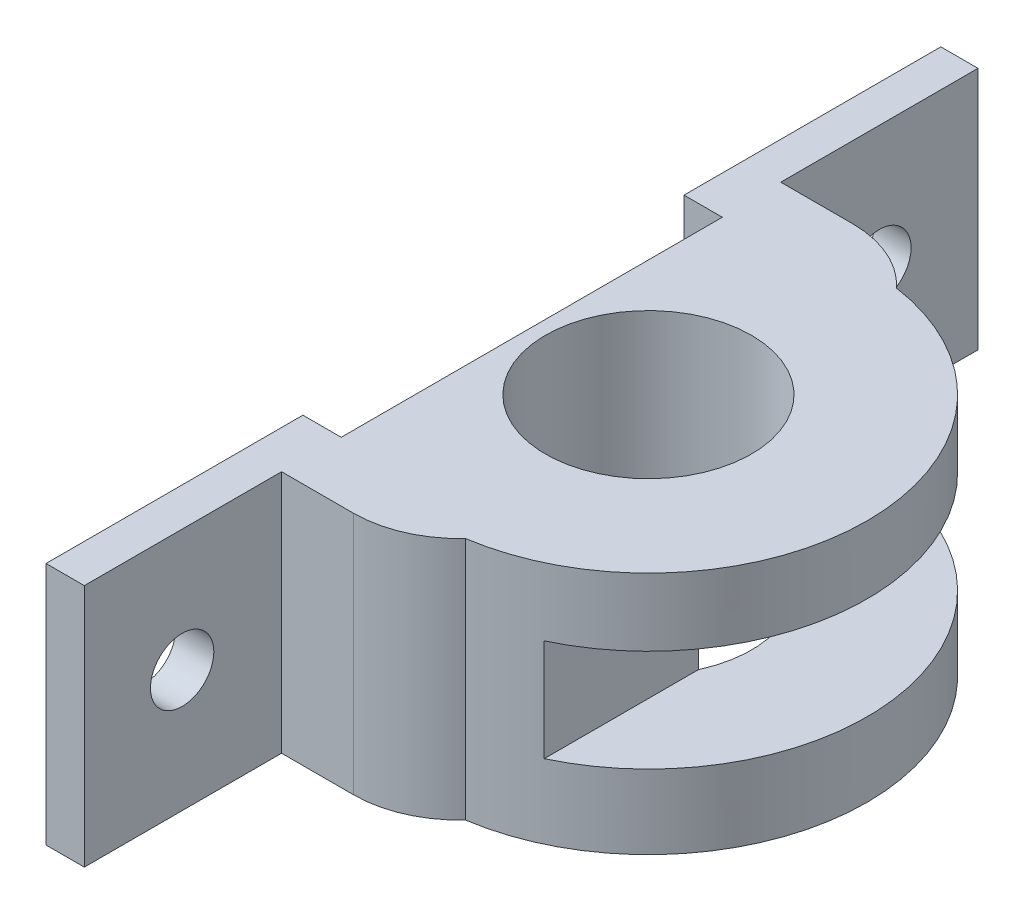
ISO-10303-21;
HEADER;
FILE_DESCRIPTION(('STEP AP214'),'2;1');
FILE_NAME('part.step','',(''),(''),'','','');
FILE_SCHEMA(('AUTOMOTIVE_DESIGN { 1 0 10303 214 1 1 1 1 }'));
ENDSEC;
DATA;
#1=APPLICATION_CONTEXT('core data for automotive mechanical design processes');
#2=APPLICATION_PROTOCOL_DEFINITION('international standard','automotive_design',2000,#1);
#3=PRODUCT_CONTEXT('',#1,'mechanical');
#4=PRODUCT('Part','Part','',(#3));
#5=PRODUCT_RELATED_PRODUCT_CATEGORY('part','',(#4));
#6=PRODUCT_DEFINITION_FORMATION('','',#4);
#7=PRODUCT_DEFINITION_CONTEXT('part definition',#1,'design');
#8=PRODUCT_DEFINITION('design','',#6,#7);
#9=PRODUCT_DEFINITION_SHAPE('','',#8);
#10=(LENGTH_UNIT() NAMED_UNIT(*) SI_UNIT(.MILLI.,.METRE.));
#11=(NAMED_UNIT(*) PLANE_ANGLE_UNIT() SI_UNIT($,.RADIAN.));
#12=(NAMED_UNIT(*) SI_UNIT($,.STERADIAN.) SOLID_ANGLE_UNIT());
#13=UNCERTAINTY_MEASURE_WITH_UNIT(LENGTH_MEASURE(1.E-05),#10,'distance_accuracy_value','');
#14=(GEOMETRIC_REPRESENTATION_CONTEXT(3) GLOBAL_UNCERTAINTY_ASSIGNED_CONTEXT((#13)) GLOBAL_UNIT_ASSIGNED_CONTEXT((#10,
#11,#12)) REPRESENTATION_CONTEXT('',''));
#15=CARTESIAN_POINT('',(0.,0.,0.));
#16=DIRECTION('',(0.,0.,1.));
#17=DIRECTION('',(1.,0.,0.));
#18=AXIS2_PLACEMENT_3D('',#15,#16,#17);
#19=CARTESIAN_POINT('',(0.,-55.2,0.));
#20=DIRECTION('',(0.,1.,0.));
#21=DIRECTION('',(0.,0.,1.));
#22=AXIS2_PLACEMENT_3D('',#19,#20,#21);
#23=CYLINDRICAL_SURFACE('',#22,20.59);
#24=CARTESIAN_POINT('',(0.,4.80402203282774,0.));
#25=DIRECTION('',(0.,1.,0.));
#26=DIRECTION('',(0.,0.,1.));
#27=AXIS2_PLACEMENT_3D('',#24,#25,#26);
#28=CIRCLE('',#27,20.59);
#29=CARTESIAN_POINT('',(8.80000000000003,4.80402203282774,18.6147280399151));
#30=VERTEX_POINT('',#29);
#31=CARTESIAN_POINT('',(8.80000000000003,4.80402203282774,-18.6147280399151));
#32=VERTEX_POINT('',#31);
#33=EDGE_CURVE('E285',#30,#32,#28,.T.);
#34=ORIENTED_EDGE('',*,*,#33,.T.);
#35=DIRECTION('',(0.,1.,0.));
#36=VECTOR('',#35,1.);
#37=CARTESIAN_POINT('',(8.80000000000003,-55.2,-18.614728039915));
#38=LINE('',#37,#36);
#39=CARTESIAN_POINT('',(8.80000000000003,-4.80402203282774,-18.614728039915));
#40=VERTEX_POINT('',#39);
#41=EDGE_CURVE('E286',#40,#32,#38,.T.);
#42=ORIENTED_EDGE('',*,*,#41,.F.);
#43=CARTESIAN_POINT('',(0.,-4.80402203282775,0.));
#44=DIRECTION('',(0.,-1.,0.));
#45=DIRECTION('',(0.,0.,-1.));
#46=AXIS2_PLACEMENT_3D('',#43,#44,#45);
#47=CIRCLE('',#46,20.59);
#48=CARTESIAN_POINT('',(8.80000000000003,-4.80402203282774,18.614728039915));
#49=VERTEX_POINT('',#48);
#50=EDGE_CURVE('E282',#40,#49,#47,.T.);
#51=ORIENTED_EDGE('',*,*,#50,.T.);
#52=DIRECTION('',(0.,1.,0.));
#53=VECTOR('',#52,1.);
#54=CARTESIAN_POINT('',(8.80000000000003,-55.2,18.614728039915));
#55=LINE('',#54,#53);
#56=EDGE_CURVE('E289',#30,#49,#55,.F.);
#57=ORIENTED_EDGE('',*,*,#56,.F.);
#58=EDGE_LOOP('',(#34,#42,#51,#57));
#59=FACE_BOUND('',#58,.T.);
#60=DIRECTION('',(0.,1.,0.));
#61=VECTOR('',#60,1.);
#62=CARTESIAN_POINT('',(3.10851186960473,-55.2,20.3539984758898));
#63=LINE('',#62,#61);
#64=CARTESIAN_POINT('',(3.10851186960473,-11.785,20.3539984758898));
#65=VERTEX_POINT('',#64);
#66=CARTESIAN_POINT('',(3.10851186960473,11.1805911601393,20.3539984758898));
#67=VERTEX_POINT('',#66);
#68=EDGE_CURVE('E274',#65,#67,#63,.T.);
#69=ORIENTED_EDGE('',*,*,#68,.F.);
#70=CARTESIAN_POINT('',(0.,-11.785,0.));
#71=DIRECTION('',(0.,1.,0.));
#72=DIRECTION('',(0.,0.,1.));
#73=AXIS2_PLACEMENT_3D('',#70,#71,#72);
#74=CIRCLE('',#73,20.59);
#75=CARTESIAN_POINT('',(3.00000000000002,-11.785,-20.3702749122342));
#76=VERTEX_POINT('',#75);
#77=EDGE_CURVE('E280',#65,#76,#74,.T.);
#78=ORIENTED_EDGE('',*,*,#77,.T.);
#79=DIRECTION('',(0.,1.,0.));
#80=VECTOR('',#79,1.);
#81=CARTESIAN_POINT('',(3.00000000000003,-55.2,-20.3702749122342));
#82=LINE('',#81,#80);
#83=CARTESIAN_POINT('',(3.00000000000002,11.1805911601393,-20.3702749122343));
#84=VERTEX_POINT('',#83);
#85=EDGE_CURVE('E278',#76,#84,#82,.T.);
#86=ORIENTED_EDGE('',*,*,#85,.T.);
#87=CARTESIAN_POINT('',(0.,11.1805911601393,0.));
#88=DIRECTION('',(0.,-1.,0.));
#89=DIRECTION('',(0.,0.,-1.));
#90=AXIS2_PLACEMENT_3D('',#87,#88,#89);
#91=CIRCLE('',#90,20.59);
#92=EDGE_CURVE('E275',#84,#67,#91,.T.);
#93=ORIENTED_EDGE('',*,*,#92,.T.);
#94=EDGE_LOOP('',(#69,#78,#86,#93));
#95=FACE_BOUND('',#94,.T.);
#96=ADVANCED_FACE('F55',(#59,#95),#23,.T.);
#97=CARTESIAN_POINT('',(-16.2413436660295,11.1805911601393,-36.1));
#98=DIRECTION('',(0.,-1.,0.));
#99=DIRECTION('',(0.,0.,-1.));
#100=AXIS2_PLACEMENT_3D('',#97,#98,#99);
#101=PLANE('',#100);
#102=DIRECTION('',(-1.,0.,0.));
#103=VECTOR('',#102,1.);
#104=CARTESIAN_POINT('',(-10.9914881303953,11.1805911601393,-17.950780817625));
#105=LINE('',#104,#103);
#106=CARTESIAN_POINT('',(-10.9914881303953,11.1805911601393,-17.950780817625));
#107=VERTEX_POINT('',#106);
#108=CARTESIAN_POINT('',(-14.6,11.1805911601393,-17.950780817625));
#109=VERTEX_POINT('',#108);
#110=EDGE_CURVE('E206',#107,#109,#105,.T.);
#111=ORIENTED_EDGE('',*,*,#110,.F.);
#112=DIRECTION('',(0.,0.,1.));
#113=VECTOR('',#112,1.);
#114=CARTESIAN_POINT('',(-10.9914881303953,11.1805911601393,-36.1));
#115=LINE('',#114,#113);
#116=CARTESIAN_POINT('',(-10.9914881303953,11.1805911601393,17.9454043331375));
#117=VERTEX_POINT('',#116);
#118=EDGE_CURVE('E199',#107,#117,#115,.T.);
#119=ORIENTED_EDGE('',*,*,#118,.T.);
#120=DIRECTION('',(1.,0.,0.));
#121=VECTOR('',#120,1.);
#122=CARTESIAN_POINT('',(-10.9914881303953,11.1805911601393,17.9454043331375));
#123=LINE('',#122,#121);
#124=CARTESIAN_POINT('',(-14.6,11.1805911601393,17.9454043331375));
#125=VERTEX_POINT('',#124);
#126=EDGE_CURVE('E210',#125,#117,#123,.T.);
#127=ORIENTED_EDGE('',*,*,#126,.F.);
#128=DIRECTION('',(0.,0.,-1.));
#129=VECTOR('',#128,1.);
#130=CARTESIAN_POINT('',(-14.6,11.1805911601393,44.689219182375));
#131=LINE('',#130,#129);
#132=CARTESIAN_POINT('',(-14.6,11.1805911601393,42.140780817625));
#133=VERTEX_POINT('',#132);
#134=EDGE_CURVE('E248',#133,#125,#131,.T.);
#135=ORIENTED_EDGE('',*,*,#134,.F.);
#136=DIRECTION('',(1.,0.,0.));
#137=VECTOR('',#136,1.);
#138=CARTESIAN_POINT('',(-16.2413436660295,11.1805911601393,42.140780817625));
#139=LINE('',#138,#137);
#140=CARTESIAN_POINT('',(-10.9914881303953,11.1805911601393,42.140780817625));
#141=VERTEX_POINT('',#140);
#142=EDGE_CURVE('E64',#133,#141,#139,.T.);
#143=ORIENTED_EDGE('',*,*,#142,.T.);
#144=DIRECTION('',(0.,0.,-1.));
#145=VECTOR('',#144,1.);
#146=CARTESIAN_POINT('',(-10.9914881303953,11.1805911601393,45.660780817625));
#147=LINE('',#146,#145);
#148=CARTESIAN_POINT('',(-10.9914881303953,11.1805911601393,23.560780817625));
#149=VERTEX_POINT('',#148);
#150=EDGE_CURVE('E242',#141,#149,#147,.T.);
#151=ORIENTED_EDGE('',*,*,#150,.T.);
#152=DIRECTION('',(-1.,0.,0.));
#153=VECTOR('',#152,1.);
#154=CARTESIAN_POINT('',(3.10851186960473,11.1805911601393,23.560780817625));
#155=LINE('',#154,#153);
#156=CARTESIAN_POINT('',(-4.2298935326226,11.1805911601393,23.560780817625));
#157=VERTEX_POINT('',#156);
#158=EDGE_CURVE('E256',#157,#149,#155,.T.);
#159=ORIENTED_EDGE('',*,*,#158,.F.);
#160=CARTESIAN_POINT('',(-4.2298935326226,11.1805911601393,13.560780817625));
#161=DIRECTION('',(0.,-1.,0.));
#162=DIRECTION('',(0.,0.,-1.));
#163=AXIS2_PLACEMENT_3D('',#160,#161,#162);
#164=CIRCLE('',#163,10.);
#165=EDGE_CURVE('E329',#157,#67,#164,.F.);
#166=ORIENTED_EDGE('',*,*,#165,.T.);
#167=ORIENTED_EDGE('',*,*,#92,.F.);
#168=CARTESIAN_POINT('',(-4.32210177975512,11.1805911601393,-13.5594874741397));
#169=DIRECTION('',(0.,-1.,0.));
#170=DIRECTION('',(0.,0.,-1.));
#171=AXIS2_PLACEMENT_3D('',#168,#169,#170);
#172=CIRCLE('',#171,10.);
#173=CARTESIAN_POINT('',(-4.32210177975512,11.1805911601393,-23.5594874741397));
#174=VERTEX_POINT('',#173);
#175=EDGE_CURVE('E268',#84,#174,#172,.F.);
#176=ORIENTED_EDGE('',*,*,#175,.T.);
#177=DIRECTION('',(1.,0.,0.));
#178=VECTOR('',#177,1.);
#179=CARTESIAN_POINT('',(-16.1,11.1805911601393,-23.5594874741397));
#180=LINE('',#179,#178);
#181=CARTESIAN_POINT('',(-11.1,11.1805911601393,-23.5594874741397));
#182=VERTEX_POINT('',#181);
#183=EDGE_CURVE('E267',#182,#174,#180,.T.);
#184=ORIENTED_EDGE('',*,*,#183,.F.);
#185=DIRECTION('',(0.,0.,-1.));
#186=VECTOR('',#185,1.);
#187=CARTESIAN_POINT('',(-11.1,11.1805911601393,-42.1394874741397));
#188=LINE('',#187,#186);
#189=CARTESIAN_POINT('',(-11.1,11.1805911601393,-42.1394874741397));
#190=VERTEX_POINT('',#189);
#191=EDGE_CURVE('E71',#182,#190,#188,.T.);
#192=ORIENTED_EDGE('',*,*,#191,.T.);
#193=DIRECTION('',(-1.,0.,0.));
#194=VECTOR('',#193,1.);
#195=CARTESIAN_POINT('',(-14.6,11.1805911601393,-42.1394874741397));
#196=LINE('',#195,#194);
#197=CARTESIAN_POINT('',(-14.6,11.1805911601393,-42.1394874741397));
#198=VERTEX_POINT('',#197);
#199=EDGE_CURVE('E12',#190,#198,#196,.T.);
#200=ORIENTED_EDGE('',*,*,#199,.T.);
#201=DIRECTION('',(0.,0.,1.));
#202=VECTOR('',#201,1.);
#203=CARTESIAN_POINT('',(-14.6,11.1805911601393,-17.410780817625));
#204=LINE('',#203,#202);
#205=EDGE_CURVE('E227',#198,#109,#204,.T.);
#206=ORIENTED_EDGE('',*,*,#205,.T.);
#207=EDGE_LOOP('',(#111,#119,#127,#135,#143,#151,#159,#166,#167,#176,#184,#192,#200,#206));
#208=FACE_BOUND('',#207,.T.);
#209=CARTESIAN_POINT('',(0.,11.1805911601393,0.));
#210=DIRECTION('',(0.,-1.,0.));
#211=DIRECTION('',(0.,0.,-1.));
#212=AXIS2_PLACEMENT_3D('',#209,#210,#211);
#213=CIRCLE('',#212,9.7);
#214=CARTESIAN_POINT('',(0.,11.1805911601393,-9.7));
#215=VERTEX_POINT('',#214);
#216=EDGE_CURVE('E270',#215,#215,#213,.T.);
#217=ORIENTED_EDGE('',*,*,#216,.T.);
#218=EDGE_LOOP('',(#217));
#219=FACE_BOUND('',#218,.T.);
#220=ADVANCED_FACE('F354',(#208,#219),#101,.F.);
#221=CARTESIAN_POINT('',(-1.39148813039528,-11.785,-34.2));
#222=DIRECTION('',(0.,1.,0.));
#223=DIRECTION('',(0.,0.,1.));
#224=AXIS2_PLACEMENT_3D('',#221,#222,#223);
#225=PLANE('',#224);
#226=DIRECTION('',(0.,0.,-1.));
#227=VECTOR('',#226,1.);
#228=CARTESIAN_POINT('',(-10.9914881303953,-11.785,-34.2));
#229=LINE('',#228,#227);
#230=CARTESIAN_POINT('',(-10.9914881303953,-11.785,17.9454043331375));
#231=VERTEX_POINT('',#230);
#232=CARTESIAN_POINT('',(-10.9914881303953,-11.785,-17.950780817625));
#233=VERTEX_POINT('',#232);
#234=EDGE_CURVE('E181',#231,#233,#229,.T.);
#235=ORIENTED_EDGE('',*,*,#234,.T.);
#236=DIRECTION('',(-1.,0.,0.));
#237=VECTOR('',#236,1.);
#238=CARTESIAN_POINT('',(-10.9914881303953,-11.785,-17.950780817625));
#239=LINE('',#238,#237);
#240=CARTESIAN_POINT('',(-14.6,-11.785,-17.950780817625));
#241=VERTEX_POINT('',#240);
#242=EDGE_CURVE('E186',#233,#241,#239,.T.);
#243=ORIENTED_EDGE('',*,*,#242,.T.);
#244=DIRECTION('',(0.,0.,-1.));
#245=VECTOR('',#244,1.);
#246=CARTESIAN_POINT('',(-14.6,-11.785,-17.410780817625));
#247=LINE('',#246,#245);
#248=CARTESIAN_POINT('',(-14.6,-11.785,-42.1394874741397));
#249=VERTEX_POINT('',#248);
#250=EDGE_CURVE('E311',#241,#249,#247,.T.);
#251=ORIENTED_EDGE('',*,*,#250,.T.);
#252=DIRECTION('',(1.,0.,0.));
#253=VECTOR('',#252,1.);
#254=CARTESIAN_POINT('',(-14.6,-11.785,-42.1394874741397));
#255=LINE('',#254,#253);
#256=CARTESIAN_POINT('',(-11.1,-11.785,-42.1394874741397));
#257=VERTEX_POINT('',#256);
#258=EDGE_CURVE('E230',#249,#257,#255,.T.);
#259=ORIENTED_EDGE('',*,*,#258,.T.);
#260=DIRECTION('',(0.,0.,1.));
#261=VECTOR('',#260,1.);
#262=CARTESIAN_POINT('',(-11.1,-11.785,-36.510780817625));
#263=LINE('',#262,#261);
#264=CARTESIAN_POINT('',(-11.1,-11.785,-23.5594874741397));
#265=VERTEX_POINT('',#264);
#266=EDGE_CURVE('E263',#257,#265,#263,.T.);
#267=ORIENTED_EDGE('',*,*,#266,.T.);
#268=DIRECTION('',(-1.,0.,0.));
#269=VECTOR('',#268,1.);
#270=CARTESIAN_POINT('',(3.00000000000002,-11.785,-23.5594874741397));
#271=LINE('',#270,#269);
#272=CARTESIAN_POINT('',(-4.32210177975512,-11.785,-23.5594874741397));
#273=VERTEX_POINT('',#272);
#274=EDGE_CURVE('E266',#273,#265,#271,.T.);
#275=ORIENTED_EDGE('',*,*,#274,.F.);
#276=CARTESIAN_POINT('',(-4.32210177975512,-11.785,-13.5594874741397));
#277=DIRECTION('',(0.,1.,0.));
#278=DIRECTION('',(0.,0.,1.));
#279=AXIS2_PLACEMENT_3D('',#276,#277,#278);
#280=CIRCLE('',#279,10.);
#281=EDGE_CURVE('E194',#273,#76,#280,.F.);
#282=ORIENTED_EDGE('',*,*,#281,.T.);
#283=ORIENTED_EDGE('',*,*,#77,.F.);
#284=CARTESIAN_POINT('',(-4.2298935326226,-11.785,13.560780817625));
#285=DIRECTION('',(0.,1.,0.));
#286=DIRECTION('',(0.,0.,1.));
#287=AXIS2_PLACEMENT_3D('',#284,#285,#286);
#288=CIRCLE('',#287,10.);
#289=CARTESIAN_POINT('',(-4.22989353262259,-11.785,23.560780817625));
#290=VERTEX_POINT('',#289);
#291=EDGE_CURVE('E325',#65,#290,#288,.F.);
#292=ORIENTED_EDGE('',*,*,#291,.T.);
#293=DIRECTION('',(-1.,0.,0.));
#294=VECTOR('',#293,1.);
#295=CARTESIAN_POINT('',(3.10851186960473,-11.785,23.560780817625));
#296=LINE('',#295,#294);
#297=CARTESIAN_POINT('',(-10.9914881303953,-11.785,23.560780817625));
#298=VERTEX_POINT('',#297);
#299=EDGE_CURVE('E259',#290,#298,#296,.T.);
#300=ORIENTED_EDGE('',*,*,#299,.T.);
#301=DIRECTION('',(0.,0.,1.));
#302=VECTOR('',#301,1.);
#303=CARTESIAN_POINT('',(-10.9914881303953,-11.785,23.560780817625));
#304=LINE('',#303,#302);
#305=CARTESIAN_POINT('',(-10.9914881303953,-11.785,42.140780817625));
#306=VERTEX_POINT('',#305);
#307=EDGE_CURVE('E245',#298,#306,#304,.T.);
#308=ORIENTED_EDGE('',*,*,#307,.T.);
#309=DIRECTION('',(1.,0.,0.));
#310=VECTOR('',#309,1.);
#311=CARTESIAN_POINT('',(-10.9914881303953,-11.785,42.140780817625));
#312=LINE('',#311,#310);
#313=CARTESIAN_POINT('',(-14.6,-11.785,42.140780817625));
#314=VERTEX_POINT('',#313);
#315=EDGE_CURVE('E236',#314,#306,#312,.T.);
#316=ORIENTED_EDGE('',*,*,#315,.F.);
#317=DIRECTION('',(0.,0.,-1.));
#318=VECTOR('',#317,1.);
#319=CARTESIAN_POINT('',(-14.6,-11.785,-17.410780817625));
#320=LINE('',#319,#318);
#321=CARTESIAN_POINT('',(-14.6,-11.785,17.9454043331375));
#322=VERTEX_POINT('',#321);
#323=EDGE_CURVE('E251',#314,#322,#320,.T.);
#324=ORIENTED_EDGE('',*,*,#323,.T.);
#325=DIRECTION('',(1.,0.,0.));
#326=VECTOR('',#325,1.);
#327=CARTESIAN_POINT('',(-10.9914881303953,-11.785,17.9454043331375));
#328=LINE('',#327,#326);
#329=EDGE_CURVE('E189',#322,#231,#328,.T.);
#330=ORIENTED_EDGE('',*,*,#329,.T.);
#331=EDGE_LOOP('',(#235,#243,#251,#259,#267,#275,#282,#283,#292,#300,#308,#316,#324,#330));
#332=FACE_BOUND('',#331,.T.);
#333=CARTESIAN_POINT('',(0.,-11.785,0.));
#334=DIRECTION('',(0.,-1.,0.));
#335=DIRECTION('',(0.,0.,-1.));
#336=AXIS2_PLACEMENT_3D('',#333,#334,#335);
#337=CIRCLE('',#336,9.7);
#338=CARTESIAN_POINT('',(0.,-11.785,-9.7));
#339=VERTEX_POINT('',#338);
#340=EDGE_CURVE('E306',#339,#339,#337,.T.);
#341=ORIENTED_EDGE('',*,*,#340,.F.);
#342=EDGE_LOOP('',(#341));
#343=FACE_BOUND('',#342,.T.);
#344=ADVANCED_FACE('F183',(#332,#343),#225,.F.);
#345=CARTESIAN_POINT('',(-10.9914881303953,-55.2,-20.68));
#346=DIRECTION('',(1.,0.,0.));
#347=DIRECTION('',(0.,0.,-1.));
#348=AXIS2_PLACEMENT_3D('',#345,#346,#347);
#349=PLANE('',#348);
#350=ORIENTED_EDGE('',*,*,#118,.F.);
#351=DIRECTION('',(0.,1.,0.));
#352=VECTOR('',#351,1.);
#353=CARTESIAN_POINT('',(-10.9914881303953,-11.785,-17.950780817625));
#354=LINE('',#353,#352);
#355=EDGE_CURVE('E197',#233,#107,#354,.T.);
#356=ORIENTED_EDGE('',*,*,#355,.F.);
#357=ORIENTED_EDGE('',*,*,#234,.F.);
#358=DIRECTION('',(0.,1.,0.));
#359=VECTOR('',#358,1.);
#360=CARTESIAN_POINT('',(-10.9914881303953,-11.785,17.9454043331375));
#361=LINE('',#360,#359);
#362=EDGE_CURVE('E216',#231,#117,#361,.T.);
#363=ORIENTED_EDGE('',*,*,#362,.T.);
#364=EDGE_LOOP('',(#350,#356,#357,#363));
#365=FACE_BOUND('',#364,.T.);
#366=ADVANCED_FACE('F198',(#365),#349,.F.);
#367=CARTESIAN_POINT('',(-14.6,11.315,-17.410780817625));
#368=DIRECTION('',(-1.,0.,0.));
#369=DIRECTION('',(0.,0.,1.));
#370=AXIS2_PLACEMENT_3D('',#367,#368,#369);
#371=PLANE('',#370);
#372=DIRECTION('',(0.,1.,0.));
#373=VECTOR('',#372,1.);
#374=CARTESIAN_POINT('',(-14.6,-11.785,-17.950780817625));
#375=LINE('',#374,#373);
#376=EDGE_CURVE('E202',#241,#109,#375,.T.);
#377=ORIENTED_EDGE('',*,*,#376,.T.);
#378=ORIENTED_EDGE('',*,*,#205,.F.);
#379=DIRECTION('',(0.,-1.,0.));
#380=VECTOR('',#379,1.);
#381=CARTESIAN_POINT('',(-14.6,11.315,-42.1394874741397));
#382=LINE('',#381,#380);
#383=EDGE_CURVE('E233',#198,#249,#382,.T.);
#384=ORIENTED_EDGE('',*,*,#383,.T.);
#385=ORIENTED_EDGE('',*,*,#250,.F.);
#386=EDGE_LOOP('',(#377,#378,#384,#385));
#387=FACE_BOUND('',#386,.T.);
#388=CARTESIAN_POINT('',(-14.6,-0.302204419938334,-32.8494874741397));
#389=DIRECTION('',(-1.,0.,0.));
#390=DIRECTION('',(0.,0.,1.));
#391=AXIS2_PLACEMENT_3D('',#388,#389,#390);
#392=CIRCLE('',#391,2.98499999999359);
#393=CARTESIAN_POINT('',(-14.6,-0.302204419938334,-29.8644874741461));
#394=VERTEX_POINT('',#393);
#395=EDGE_CURVE('E219',#394,#394,#392,.T.);
#396=ORIENTED_EDGE('',*,*,#395,.F.);
#397=EDGE_LOOP('',(#396));
#398=FACE_BOUND('',#397,.T.);
#399=ADVANCED_FACE('F366',(#387,#398),#371,.T.);
#400=CARTESIAN_POINT('',(8.80000000000003,4.80402203282774,22.440347469412));
#401=DIRECTION('',(0.,1.,0.));
#402=DIRECTION('',(0.,0.,1.));
#403=AXIS2_PLACEMENT_3D('',#400,#401,#402);
#404=PLANE('',#403);
#405=ORIENTED_EDGE('',*,*,#33,.F.);
#406=DIRECTION('',(0.,0.,1.));
#407=VECTOR('',#406,1.);
#408=CARTESIAN_POINT('',(8.80000000000003,4.80402203282774,22.440347469412));
#409=LINE('',#408,#407);
#410=CARTESIAN_POINT('',(8.80000000000003,4.80402203282774,4.08044115262057));
#411=VERTEX_POINT('',#410);
#412=EDGE_CURVE('E292',#411,#30,#409,.T.);
#413=ORIENTED_EDGE('',*,*,#412,.F.);
#414=CARTESIAN_POINT('',(0.,4.80402203282774,0.));
#415=DIRECTION('',(0.,1.,0.));
#416=DIRECTION('',(0.,0.,1.));
#417=AXIS2_PLACEMENT_3D('',#414,#415,#416);
#418=CIRCLE('',#417,9.7);
#419=CARTESIAN_POINT('',(8.80000000000003,4.80402203282774,-4.08044115262056));
#420=VERTEX_POINT('',#419);
#421=EDGE_CURVE('E193',#411,#420,#418,.T.);
#422=ORIENTED_EDGE('',*,*,#421,.T.);
#423=EDGE_CURVE('E288',#32,#420,#409,.T.);
#424=ORIENTED_EDGE('',*,*,#423,.F.);
#425=EDGE_LOOP('',(#405,#413,#422,#424));
#426=FACE_BOUND('',#425,.T.);
#427=ADVANCED_FACE('F367',(#426),#404,.F.);
#428=CARTESIAN_POINT('',(8.80000000000003,0.,0.));
#429=DIRECTION('',(1.,0.,0.));
#430=DIRECTION('',(0.,0.,-1.));
#431=AXIS2_PLACEMENT_3D('',#428,#429,#430);
#432=PLANE('',#431);
#433=ORIENTED_EDGE('',*,*,#41,.T.);
#434=ORIENTED_EDGE('',*,*,#423,.T.);
#435=DIRECTION('',(0.,-1.,0.));
#436=VECTOR('',#435,1.);
#437=CARTESIAN_POINT('',(8.80000000000003,11.1805911601393,-4.08044115262056));
#438=LINE('',#437,#436);
#439=CARTESIAN_POINT('',(8.80000000000003,-4.80402203282775,-4.08044115262056));
#440=VERTEX_POINT('',#439);
#441=EDGE_CURVE('E297',#440,#420,#438,.F.);
#442=ORIENTED_EDGE('',*,*,#441,.F.);
#443=DIRECTION('',(0.,0.,-1.));
#444=VECTOR('',#443,1.);
#445=CARTESIAN_POINT('',(8.80000000000003,-4.80402203282774,22.440347469412));
#446=LINE('',#445,#444);
#447=EDGE_CURVE('E293',#440,#40,#446,.T.);
#448=ORIENTED_EDGE('',*,*,#447,.T.);
#449=EDGE_LOOP('',(#433,#434,#442,#448));
#450=FACE_BOUND('',#449,.T.);
#451=ADVANCED_FACE('F370',(#450),#432,.T.);
#452=ORIENTED_EDGE('',*,*,#412,.T.);
#453=ORIENTED_EDGE('',*,*,#56,.T.);
#454=CARTESIAN_POINT('',(8.80000000000003,-4.80402203282774,4.08044115262056));
#455=VERTEX_POINT('',#454);
#456=EDGE_CURVE('E291',#49,#455,#446,.T.);
#457=ORIENTED_EDGE('',*,*,#456,.T.);
#458=DIRECTION('',(0.,-1.,0.));
#459=VECTOR('',#458,1.);
#460=CARTESIAN_POINT('',(8.80000000000003,11.1805911601393,4.08044115262056));
#461=LINE('',#460,#459);
#462=EDGE_CURVE('E300',#411,#455,#461,.T.);
#463=ORIENTED_EDGE('',*,*,#462,.F.);
#464=EDGE_LOOP('',(#452,#453,#457,#463));
#465=FACE_BOUND('',#464,.T.);
#466=ADVANCED_FACE('F376',(#465),#432,.T.);
#467=CARTESIAN_POINT('',(8.80000000000003,-4.80402203282774,22.440347469412));
#468=DIRECTION('',(0.,-1.,0.));
#469=DIRECTION('',(0.,0.,-1.));
#470=AXIS2_PLACEMENT_3D('',#467,#468,#469);
#471=PLANE('',#470);
#472=ORIENTED_EDGE('',*,*,#447,.F.);
#473=CARTESIAN_POINT('',(0.,-4.80402203282775,0.));
#474=DIRECTION('',(0.,-1.,0.));
#475=DIRECTION('',(0.,0.,-1.));
#476=AXIS2_PLACEMENT_3D('',#473,#474,#475);
#477=CIRCLE('',#476,9.7);
#478=EDGE_CURVE('E277',#440,#455,#477,.T.);
#479=ORIENTED_EDGE('',*,*,#478,.T.);
#480=ORIENTED_EDGE('',*,*,#456,.F.);
#481=ORIENTED_EDGE('',*,*,#50,.F.);
#482=EDGE_LOOP('',(#472,#479,#480,#481));
#483=FACE_BOUND('',#482,.T.);
#484=ADVANCED_FACE('F372',(#483),#471,.F.);
#485=CARTESIAN_POINT('',(0.,11.1805911601393,0.));
#486=DIRECTION('',(0.,-1.,0.));
#487=DIRECTION('',(0.,0.,-1.));
#488=AXIS2_PLACEMENT_3D('',#485,#486,#487);
#489=CYLINDRICAL_SURFACE('',#488,9.7);
#490=ORIENTED_EDGE('',*,*,#441,.T.);
#491=ORIENTED_EDGE('',*,*,#421,.F.);
#492=ORIENTED_EDGE('',*,*,#462,.T.);
#493=ORIENTED_EDGE('',*,*,#478,.F.);
#494=EDGE_LOOP('',(#490,#491,#492,#493));
#495=FACE_BOUND('',#494,.T.);
#496=ORIENTED_EDGE('',*,*,#216,.F.);
#497=EDGE_LOOP('',(#496));
#498=FACE_BOUND('',#497,.T.);
#499=ORIENTED_EDGE('',*,*,#340,.T.);
#500=EDGE_LOOP('',(#499));
#501=FACE_BOUND('',#500,.T.);
#502=ADVANCED_FACE('F375',(#495,#498,#501),#489,.F.);
#503=CARTESIAN_POINT('',(3.00000000000002,-11.785,-23.5594874741397));
#504=DIRECTION('',(0.,0.,1.));
#505=DIRECTION('',(1.,0.,0.));
#506=AXIS2_PLACEMENT_3D('',#503,#504,#505);
#507=PLANE('',#506);
#508=ORIENTED_EDGE('',*,*,#183,.T.);
#509=DIRECTION('',(0.,1.,0.));
#510=VECTOR('',#509,1.);
#511=CARTESIAN_POINT('',(-4.32210177975512,-11.785,-23.5594874741397));
#512=LINE('',#511,#510);
#513=EDGE_CURVE('E264',#174,#273,#512,.F.);
#514=ORIENTED_EDGE('',*,*,#513,.T.);
#515=ORIENTED_EDGE('',*,*,#274,.T.);
#516=DIRECTION('',(0.,1.,0.));
#517=VECTOR('',#516,1.);
#518=CARTESIAN_POINT('',(-11.1,-11.785,-23.5594874741397));
#519=LINE('',#518,#517);
#520=EDGE_CURVE('E271',#265,#182,#519,.T.);
#521=ORIENTED_EDGE('',*,*,#520,.T.);
#522=EDGE_LOOP('',(#508,#514,#515,#521));
#523=FACE_BOUND('',#522,.T.);
#524=ADVANCED_FACE('F383',(#523),#507,.F.);
#525=CARTESIAN_POINT('',(-11.1,11.1805911601393,-36.510780817625));
#526=DIRECTION('',(1.,0.,0.));
#527=DIRECTION('',(0.,0.,-1.));
#528=AXIS2_PLACEMENT_3D('',#525,#526,#527);
#529=PLANE('',#528);
#530=CARTESIAN_POINT('',(-11.1,-0.302204419938334,-32.8494874741397));
#531=DIRECTION('',(1.,0.,0.));
#532=DIRECTION('',(0.,0.,-1.));
#533=AXIS2_PLACEMENT_3D('',#530,#531,#532);
#534=CIRCLE('',#533,2.98499999999359);
#535=CARTESIAN_POINT('',(-11.1,-0.302204419938334,-35.8344874741333));
#536=VERTEX_POINT('',#535);
#537=EDGE_CURVE('E59',#536,#536,#534,.T.);
#538=ORIENTED_EDGE('',*,*,#537,.F.);
#539=EDGE_LOOP('',(#538));
#540=FACE_BOUND('',#539,.T.);
#541=ORIENTED_EDGE('',*,*,#191,.F.);
#542=ORIENTED_EDGE('',*,*,#520,.F.);
#543=ORIENTED_EDGE('',*,*,#266,.F.);
#544=DIRECTION('',(0.,-1.,0.));
#545=VECTOR('',#544,1.);
#546=CARTESIAN_POINT('',(-11.1,11.315,-42.1394874741397));
#547=LINE('',#546,#545);
#548=EDGE_CURVE('E234',#190,#257,#547,.T.);
#549=ORIENTED_EDGE('',*,*,#548,.F.);
#550=EDGE_LOOP('',(#541,#542,#543,#549));
#551=FACE_BOUND('',#550,.T.);
#552=ADVANCED_FACE('F387',(#540,#551),#529,.T.);
#553=CARTESIAN_POINT('',(-4.32210177975512,-55.2,-13.5594874741397));
#554=DIRECTION('',(0.,1.,0.));
#555=DIRECTION('',(0.,0.,1.));
#556=AXIS2_PLACEMENT_3D('',#553,#554,#555);
#557=CYLINDRICAL_SURFACE('',#556,10.);
#558=ORIENTED_EDGE('',*,*,#281,.F.);
#559=ORIENTED_EDGE('',*,*,#513,.F.);
#560=ORIENTED_EDGE('',*,*,#175,.F.);
#561=ORIENTED_EDGE('',*,*,#85,.F.);
#562=EDGE_LOOP('',(#558,#559,#560,#561));
#563=FACE_BOUND('',#562,.T.);
#564=ADVANCED_FACE('F363',(#563),#557,.T.);
#565=CARTESIAN_POINT('',(3.10851186960473,-11.785,23.560780817625));
#566=DIRECTION('',(0.,0.,-1.));
#567=DIRECTION('',(-1.,0.,0.));
#568=AXIS2_PLACEMENT_3D('',#565,#566,#567);
#569=PLANE('',#568);
#570=ORIENTED_EDGE('',*,*,#299,.F.);
#571=DIRECTION('',(0.,1.,0.));
#572=VECTOR('',#571,1.);
#573=CARTESIAN_POINT('',(-4.2298935326226,-11.785,23.560780817625));
#574=LINE('',#573,#572);
#575=EDGE_CURVE('E327',#290,#157,#574,.T.);
#576=ORIENTED_EDGE('',*,*,#575,.T.);
#577=ORIENTED_EDGE('',*,*,#158,.T.);
#578=DIRECTION('',(0.,-1.,0.));
#579=VECTOR('',#578,1.);
#580=CARTESIAN_POINT('',(-10.9914881303953,-11.785,23.560780817625));
#581=LINE('',#580,#579);
#582=EDGE_CURVE('E253',#149,#298,#581,.T.);
#583=ORIENTED_EDGE('',*,*,#582,.T.);
#584=EDGE_LOOP('',(#570,#576,#577,#583));
#585=FACE_BOUND('',#584,.T.);
#586=ADVANCED_FACE('F348',(#585),#569,.F.);
#587=CARTESIAN_POINT('',(-10.9914881303953,11.315,23.560780817625));
#588=DIRECTION('',(1.,0.,0.));
#589=DIRECTION('',(0.,0.,-1.));
#590=AXIS2_PLACEMENT_3D('',#587,#588,#589);
#591=PLANE('',#590);
#592=CARTESIAN_POINT('',(-10.9914881303953,-0.302204419930327,32.9286686363162));
#593=DIRECTION('',(1.,0.,0.));
#594=DIRECTION('',(0.,0.,-1.));
#595=AXIS2_PLACEMENT_3D('',#592,#593,#594);
#596=CIRCLE('',#595,2.985);
#597=CARTESIAN_POINT('',(-10.9914881303953,-0.302204419930327,29.9436686363162));
#598=VERTEX_POINT('',#597);
#599=EDGE_CURVE('E222',#598,#598,#596,.T.);
#600=ORIENTED_EDGE('',*,*,#599,.F.);
#601=EDGE_LOOP('',(#600));
#602=FACE_BOUND('',#601,.T.);
#603=DIRECTION('',(0.,-1.,0.));
#604=VECTOR('',#603,1.);
#605=CARTESIAN_POINT('',(-10.9914881303953,11.315,42.140780817625));
#606=LINE('',#605,#604);
#607=EDGE_CURVE('E79',#141,#306,#606,.T.);
#608=ORIENTED_EDGE('',*,*,#607,.T.);
#609=ORIENTED_EDGE('',*,*,#307,.F.);
#610=ORIENTED_EDGE('',*,*,#582,.F.);
#611=ORIENTED_EDGE('',*,*,#150,.F.);
#612=EDGE_LOOP('',(#608,#609,#610,#611));
#613=FACE_BOUND('',#612,.T.);
#614=ADVANCED_FACE('F339',(#602,#613),#591,.T.);
#615=CARTESIAN_POINT('',(-14.6,11.315,-17.410780817625));
#616=DIRECTION('',(-1.,0.,0.));
#617=DIRECTION('',(0.,0.,1.));
#618=AXIS2_PLACEMENT_3D('',#615,#616,#617);
#619=PLANE('',#618);
#620=DIRECTION('',(0.,1.,0.));
#621=VECTOR('',#620,1.);
#622=CARTESIAN_POINT('',(-14.6,-11.785,17.9454043331375));
#623=LINE('',#622,#621);
#624=EDGE_CURVE('E213',#322,#125,#623,.T.);
#625=ORIENTED_EDGE('',*,*,#624,.F.);
#626=ORIENTED_EDGE('',*,*,#323,.F.);
#627=DIRECTION('',(0.,-1.,0.));
#628=VECTOR('',#627,1.);
#629=CARTESIAN_POINT('',(-14.6,11.315,42.140780817625));
#630=LINE('',#629,#628);
#631=EDGE_CURVE('E240',#133,#314,#630,.T.);
#632=ORIENTED_EDGE('',*,*,#631,.F.);
#633=ORIENTED_EDGE('',*,*,#134,.T.);
#634=EDGE_LOOP('',(#625,#626,#632,#633));
#635=FACE_BOUND('',#634,.T.);
#636=CARTESIAN_POINT('',(-14.6,-0.302204419930327,32.9286686363162));
#637=DIRECTION('',(-1.,0.,0.));
#638=DIRECTION('',(0.,0.,1.));
#639=AXIS2_PLACEMENT_3D('',#636,#637,#638);
#640=CIRCLE('',#639,2.985);
#641=CARTESIAN_POINT('',(-14.6,-0.302204419930327,35.9136686363162));
#642=VERTEX_POINT('',#641);
#643=EDGE_CURVE('E225',#642,#642,#640,.T.);
#644=ORIENTED_EDGE('',*,*,#643,.F.);
#645=EDGE_LOOP('',(#644));
#646=FACE_BOUND('',#645,.T.);
#647=ADVANCED_FACE('F337',(#635,#646),#619,.T.);
#648=CARTESIAN_POINT('',(-4.2298935326226,-55.2,13.560780817625));
#649=DIRECTION('',(0.,1.,0.));
#650=DIRECTION('',(0.,0.,1.));
#651=AXIS2_PLACEMENT_3D('',#648,#649,#650);
#652=CYLINDRICAL_SURFACE('',#651,10.);
#653=ORIENTED_EDGE('',*,*,#165,.F.);
#654=ORIENTED_EDGE('',*,*,#575,.F.);
#655=ORIENTED_EDGE('',*,*,#291,.F.);
#656=ORIENTED_EDGE('',*,*,#68,.T.);
#657=EDGE_LOOP('',(#653,#654,#655,#656));
#658=FACE_BOUND('',#657,.T.);
#659=ADVANCED_FACE('F57',(#658),#652,.T.);
#660=CARTESIAN_POINT('',(-10.9914881303953,11.315,42.140780817625));
#661=DIRECTION('',(0.,0.,-1.));
#662=DIRECTION('',(-1.,0.,0.));
#663=AXIS2_PLACEMENT_3D('',#660,#661,#662);
#664=PLANE('',#663);
#665=ORIENTED_EDGE('',*,*,#631,.T.);
#666=ORIENTED_EDGE('',*,*,#315,.T.);
#667=ORIENTED_EDGE('',*,*,#607,.F.);
#668=ORIENTED_EDGE('',*,*,#142,.F.);
#669=EDGE_LOOP('',(#665,#666,#667,#668));
#670=FACE_BOUND('',#669,.T.);
#671=ADVANCED_FACE('F346',(#670),#664,.F.);
#672=CARTESIAN_POINT('',(-14.6,11.315,-42.1394874741397));
#673=DIRECTION('',(0.,0.,-1.));
#674=DIRECTION('',(-1.,0.,0.));
#675=AXIS2_PLACEMENT_3D('',#672,#673,#674);
#676=PLANE('',#675);
#677=ORIENTED_EDGE('',*,*,#199,.F.);
#678=ORIENTED_EDGE('',*,*,#548,.T.);
#679=ORIENTED_EDGE('',*,*,#258,.F.);
#680=ORIENTED_EDGE('',*,*,#383,.F.);
#681=EDGE_LOOP('',(#677,#678,#679,#680));
#682=FACE_BOUND('',#681,.T.);
#683=ADVANCED_FACE('F469',(#682),#676,.T.);
#684=CARTESIAN_POINT('',(-34.0914881303953,-0.302204419930327,32.9286686363162));
#685=DIRECTION('',(1.,0.,0.));
#686=DIRECTION('',(0.,0.,-1.));
#687=AXIS2_PLACEMENT_3D('',#684,#685,#686);
#688=CYLINDRICAL_SURFACE('',#687,2.985);
#689=ORIENTED_EDGE('',*,*,#643,.T.);
#690=EDGE_LOOP('',(#689));
#691=FACE_BOUND('',#690,.T.);
#692=ORIENTED_EDGE('',*,*,#599,.T.);
#693=EDGE_LOOP('',(#692));
#694=FACE_BOUND('',#693,.T.);
#695=ADVANCED_FACE('F334',(#691,#694),#688,.F.);
#696=CARTESIAN_POINT('',(-34.0914881303953,-0.302204419938334,-32.8494874741397));
#697=DIRECTION('',(1.,0.,0.));
#698=DIRECTION('',(0.,0.,-1.));
#699=AXIS2_PLACEMENT_3D('',#696,#697,#698);
#700=CYLINDRICAL_SURFACE('',#699,2.98499999999359);
#701=ORIENTED_EDGE('',*,*,#395,.T.);
#702=EDGE_LOOP('',(#701));
#703=FACE_BOUND('',#702,.T.);
#704=ORIENTED_EDGE('',*,*,#537,.T.);
#705=EDGE_LOOP('',(#704));
#706=FACE_BOUND('',#705,.T.);
#707=ADVANCED_FACE('F468',(#703,#706),#700,.F.);
#708=CARTESIAN_POINT('',(-10.9914881303953,-11.785,17.9454043331375));
#709=DIRECTION('',(0.,0.,1.));
#710=DIRECTION('',(1.,0.,0.));
#711=AXIS2_PLACEMENT_3D('',#708,#709,#710);
#712=PLANE('',#711);
#713=ORIENTED_EDGE('',*,*,#126,.T.);
#714=ORIENTED_EDGE('',*,*,#362,.F.);
#715=ORIENTED_EDGE('',*,*,#329,.F.);
#716=ORIENTED_EDGE('',*,*,#624,.T.);
#717=EDGE_LOOP('',(#713,#714,#715,#716));
#718=FACE_BOUND('',#717,.T.);
#719=ADVANCED_FACE('F479',(#718),#712,.F.);
#720=CARTESIAN_POINT('',(-10.9914881303953,-11.785,-17.950780817625));
#721=DIRECTION('',(0.,0.,-1.));
#722=DIRECTION('',(-1.,0.,0.));
#723=AXIS2_PLACEMENT_3D('',#720,#721,#722);
#724=PLANE('',#723);
#725=ORIENTED_EDGE('',*,*,#110,.T.);
#726=ORIENTED_EDGE('',*,*,#376,.F.);
#727=ORIENTED_EDGE('',*,*,#242,.F.);
#728=ORIENTED_EDGE('',*,*,#355,.T.);
#729=EDGE_LOOP('',(#725,#726,#727,#728));
#730=FACE_BOUND('',#729,.T.);
#731=ADVANCED_FACE('F204',(#730),#724,.F.);
#732=CLOSED_SHELL('',(#96,#220,#344,#366,#399,#427,#451,#466,#484,#502,#524,#552,#564,#586,#614,
#647,#659,#671,#683,#695,#707,#719,#731));
#733=MANIFOLD_SOLID_BREP('B2',#732);
#734=ADVANCED_BREP_SHAPE_REPRESENTATION('',(#18,#733),#14);
#735=SHAPE_DEFINITION_REPRESENTATION(#9,#734);
ENDSEC;
END-ISO-10303-21;
